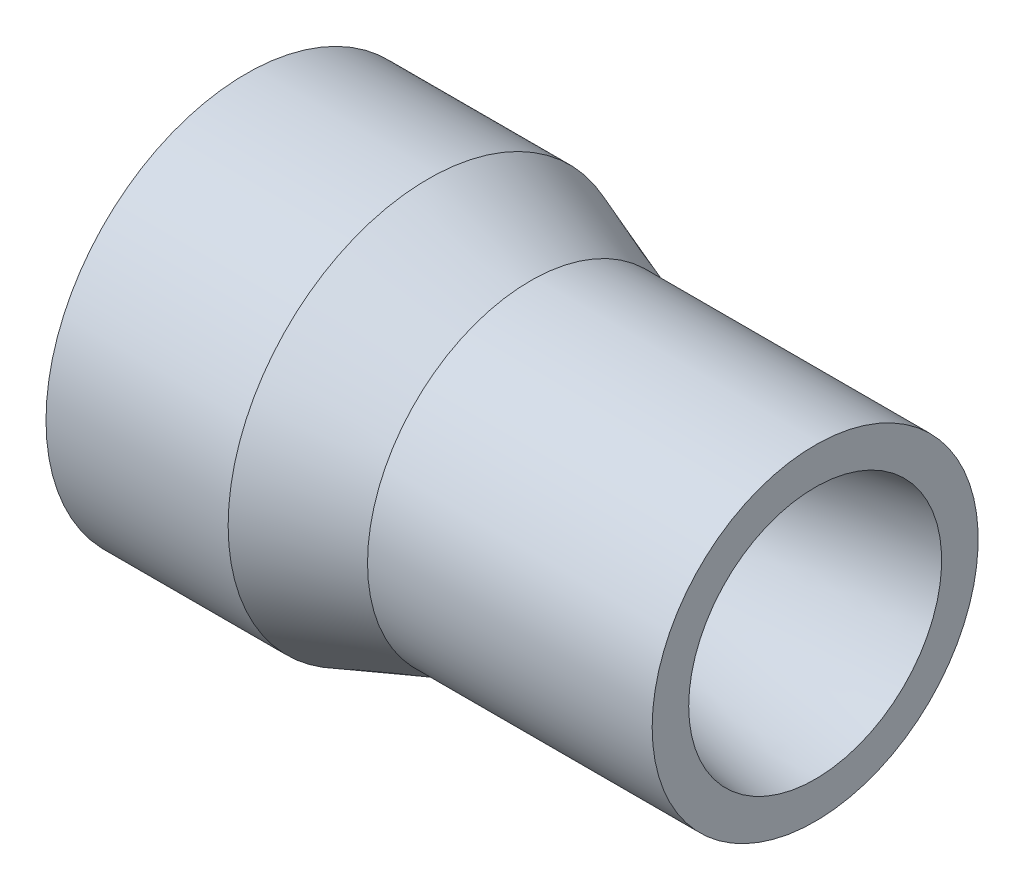
ISO-10303-21;
HEADER;
FILE_DESCRIPTION(('STEP AP214'),'2;1');
FILE_NAME('part.step','',(''),(''),'','','');
FILE_SCHEMA(('AUTOMOTIVE_DESIGN { 1 0 10303 214 1 1 1 1 }'));
ENDSEC;
DATA;
#1=APPLICATION_CONTEXT('core data for automotive mechanical design processes');
#2=APPLICATION_PROTOCOL_DEFINITION('international standard','automotive_design',2000,#1);
#3=PRODUCT_CONTEXT('',#1,'mechanical');
#4=PRODUCT('Part','Part','',(#3));
#5=PRODUCT_RELATED_PRODUCT_CATEGORY('part','',(#4));
#6=PRODUCT_DEFINITION_FORMATION('','',#4);
#7=PRODUCT_DEFINITION_CONTEXT('part definition',#1,'design');
#8=PRODUCT_DEFINITION('design','',#6,#7);
#9=PRODUCT_DEFINITION_SHAPE('','',#8);
#10=(LENGTH_UNIT() NAMED_UNIT(*) SI_UNIT(.MILLI.,.METRE.));
#11=(NAMED_UNIT(*) PLANE_ANGLE_UNIT() SI_UNIT($,.RADIAN.));
#12=(NAMED_UNIT(*) SI_UNIT($,.STERADIAN.) SOLID_ANGLE_UNIT());
#13=UNCERTAINTY_MEASURE_WITH_UNIT(LENGTH_MEASURE(1.E-05),#10,'distance_accuracy_value','');
#14=(GEOMETRIC_REPRESENTATION_CONTEXT(3) GLOBAL_UNCERTAINTY_ASSIGNED_CONTEXT((#13)) GLOBAL_UNIT_ASSIGNED_CONTEXT((#10,
#11,#12)) REPRESENTATION_CONTEXT('',''));
#15=CARTESIAN_POINT('',(0.,0.,0.));
#16=DIRECTION('',(0.,0.,1.));
#17=DIRECTION('',(1.,0.,0.));
#18=AXIS2_PLACEMENT_3D('',#15,#16,#17);
#19=CARTESIAN_POINT('',(-2.79521626221381,0.,0.));
#20=DIRECTION('',(-1.,0.,0.));
#21=DIRECTION('',(0.,0.,1.));
#22=AXIS2_PLACEMENT_3D('',#19,#20,#21);
#23=DEGENERATE_TOROIDAL_SURFACE('',#22,42.7018551138408,85.61,.F.);
#24=CARTESIAN_POINT('',(40.0097837377863,0.,0.));
#25=DIRECTION('',(-1.,0.,0.));
#26=DIRECTION('',(0.,0.,1.));
#27=AXIS2_PLACEMENT_3D('',#24,#25,#26);
#28=CIRCLE('',#27,31.4385797041449);
#29=CARTESIAN_POINT('',(40.0097837377863,0.,31.4385797041449));
#30=VERTEX_POINT('',#29);
#31=EDGE_CURVE('E86',#30,#30,#28,.T.);
#32=ORIENTED_EDGE('',*,*,#31,.F.);
#33=EDGE_LOOP('',(#32));
#34=FACE_BOUND('',#33,.T.);
#35=CARTESIAN_POINT('',(0.,0.,0.));
#36=DIRECTION('',(-1.,0.,0.));
#37=DIRECTION('',(0.,0.,1.));
#38=AXIS2_PLACEMENT_3D('',#35,#36,#37);
#39=CIRCLE('',#38,42.8625);
#40=CARTESIAN_POINT('',(0.,0.,42.8625));
#41=VERTEX_POINT('',#40);
#42=EDGE_CURVE('E10',#41,#41,#39,.T.);
#43=ORIENTED_EDGE('',*,*,#42,.T.);
#44=EDGE_LOOP('',(#43));
#45=FACE_BOUND('',#44,.T.);
#46=ADVANCED_FACE('F41',(#34,#45),#23,.T.);
#47=CARTESIAN_POINT('',(0.,42.8625,0.));
#48=DIRECTION('',(1.,0.,0.));
#49=DIRECTION('',(0.,0.,-1.));
#50=AXIS2_PLACEMENT_3D('',#47,#48,#49);
#51=PLANE('',#50);
#52=ORIENTED_EDGE('',*,*,#42,.F.);
#53=EDGE_LOOP('',(#52));
#54=FACE_BOUND('',#53,.T.);
#55=CARTESIAN_POINT('',(0.,0.,0.));
#56=DIRECTION('',(-1.,0.,0.));
#57=DIRECTION('',(0.,0.,1.));
#58=AXIS2_PLACEMENT_3D('',#55,#56,#57);
#59=CIRCLE('',#58,52.197);
#60=CARTESIAN_POINT('',(0.,0.,52.197));
#61=VERTEX_POINT('',#60);
#62=EDGE_CURVE('E48',#61,#61,#59,.T.);
#63=ORIENTED_EDGE('',*,*,#62,.T.);
#64=EDGE_LOOP('',(#63));
#65=FACE_BOUND('',#64,.T.);
#66=ADVANCED_FACE('F118',(#54,#65),#51,.F.);
#67=CARTESIAN_POINT('',(0.,0.,0.));
#68=DIRECTION('',(-1.,0.,0.));
#69=DIRECTION('',(0.,0.,1.));
#70=AXIS2_PLACEMENT_3D('',#67,#68,#69);
#71=CYLINDRICAL_SURFACE('',#70,52.197);
#72=ORIENTED_EDGE('',*,*,#62,.F.);
#73=EDGE_LOOP('',(#72));
#74=FACE_BOUND('',#73,.T.);
#75=CARTESIAN_POINT('',(47.4877114635485,0.,0.));
#76=DIRECTION('',(-1.,0.,0.));
#77=DIRECTION('',(0.,0.,1.));
#78=AXIS2_PLACEMENT_3D('',#75,#76,#77);
#79=CIRCLE('',#78,52.197);
#80=CARTESIAN_POINT('',(47.4877114635485,0.,52.197));
#81=VERTEX_POINT('',#80);
#82=EDGE_CURVE('E54',#81,#81,#79,.T.);
#83=ORIENTED_EDGE('',*,*,#82,.T.);
#84=EDGE_LOOP('',(#83));
#85=FACE_BOUND('',#84,.T.);
#86=ADVANCED_FACE('F115',(#74,#85),#71,.T.);
#87=CARTESIAN_POINT('',(74.13,0.,0.));
#88=DIRECTION('',(-1.,0.,0.));
#89=DIRECTION('',(0.,0.,1.));
#90=AXIS2_PLACEMENT_3D('',#87,#88,#89);
#91=CONICAL_SURFACE('',#90,42.5,0.349065850398866);
#92=ORIENTED_EDGE('',*,*,#82,.F.);
#93=EDGE_LOOP('',(#92));
#94=FACE_BOUND('',#93,.T.);
#95=CARTESIAN_POINT('',(74.13,0.,0.));
#96=DIRECTION('',(-1.,0.,0.));
#97=DIRECTION('',(0.,0.,1.));
#98=AXIS2_PLACEMENT_3D('',#95,#96,#97);
#99=CIRCLE('',#98,42.5);
#100=CARTESIAN_POINT('',(74.13,0.,42.5));
#101=VERTEX_POINT('',#100);
#102=EDGE_CURVE('E60',#101,#101,#99,.T.);
#103=ORIENTED_EDGE('',*,*,#102,.T.);
#104=EDGE_LOOP('',(#103));
#105=FACE_BOUND('',#104,.T.);
#106=ADVANCED_FACE('F111',(#94,#105),#91,.T.);
#107=CARTESIAN_POINT('',(0.,0.,0.));
#108=DIRECTION('',(-1.,0.,0.));
#109=DIRECTION('',(0.,0.,1.));
#110=AXIS2_PLACEMENT_3D('',#107,#108,#109);
#111=CYLINDRICAL_SURFACE('',#110,42.5);
#112=ORIENTED_EDGE('',*,*,#102,.F.);
#113=EDGE_LOOP('',(#112));
#114=FACE_BOUND('',#113,.T.);
#115=CARTESIAN_POINT('',(148.34,0.,0.));
#116=DIRECTION('',(-1.,0.,0.));
#117=DIRECTION('',(0.,0.,1.));
#118=AXIS2_PLACEMENT_3D('',#115,#116,#117);
#119=CIRCLE('',#118,42.5);
#120=CARTESIAN_POINT('',(148.34,0.,42.5));
#121=VERTEX_POINT('',#120);
#122=EDGE_CURVE('E66',#121,#121,#119,.T.);
#123=ORIENTED_EDGE('',*,*,#122,.T.);
#124=EDGE_LOOP('',(#123));
#125=FACE_BOUND('',#124,.T.);
#126=ADVANCED_FACE('F107',(#114,#125),#111,.T.);
#127=CARTESIAN_POINT('',(148.34,32.975,0.));
#128=DIRECTION('',(-1.,0.,0.));
#129=DIRECTION('',(0.,0.,1.));
#130=AXIS2_PLACEMENT_3D('',#127,#128,#129);
#131=PLANE('',#130);
#132=ORIENTED_EDGE('',*,*,#122,.F.);
#133=EDGE_LOOP('',(#132));
#134=FACE_BOUND('',#133,.T.);
#135=CARTESIAN_POINT('',(148.34,0.,0.));
#136=DIRECTION('',(-1.,0.,0.));
#137=DIRECTION('',(0.,0.,1.));
#138=AXIS2_PLACEMENT_3D('',#135,#136,#137);
#139=CIRCLE('',#138,32.975);
#140=CARTESIAN_POINT('',(148.34,0.,32.975));
#141=VERTEX_POINT('',#140);
#142=EDGE_CURVE('E70',#141,#141,#139,.T.);
#143=ORIENTED_EDGE('',*,*,#142,.T.);
#144=EDGE_LOOP('',(#143));
#145=FACE_BOUND('',#144,.T.);
#146=ADVANCED_FACE('F102',(#134,#145),#131,.F.);
#147=CARTESIAN_POINT('',(76.0448047049782,15.6078337942569,0.));
#148=CARTESIAN_POINT('',(97.2352372555907,22.9622506153776,0.));
#149=CARTESIAN_POINT('',(126.012294014913,29.8370455638665,0.));
#150=CARTESIAN_POINT('',(148.34,32.975,0.));
#151=B_SPLINE_CURVE_WITH_KNOTS('',3,(#147,#148,#149,#150),.UNSPECIFIED.,.F.,.F.,(4,4),(0.,1.),.UNSPECIFIED.);
#152=CARTESIAN_POINT('',(0.,0.,0.));
#153=DIRECTION('',(-1.,0.,0.));
#154=AXIS1_PLACEMENT('',#152,#153);
#155=SURFACE_OF_REVOLUTION('',#151,#154);
#156=ORIENTED_EDGE('',*,*,#142,.F.);
#157=EDGE_LOOP('',(#156));
#158=FACE_BOUND('',#157,.T.);
#159=CARTESIAN_POINT('',(76.0448047049782,0.,0.));
#160=DIRECTION('',(-1.,0.,0.));
#161=DIRECTION('',(0.,0.,1.));
#162=AXIS2_PLACEMENT_3D('',#159,#160,#161);
#163=CIRCLE('',#162,15.6078337942569);
#164=CARTESIAN_POINT('',(76.0448047049782,0.,15.6078337942569));
#165=VERTEX_POINT('',#164);
#166=EDGE_CURVE('E74',#165,#165,#163,.T.);
#167=ORIENTED_EDGE('',*,*,#166,.T.);
#168=EDGE_LOOP('',(#167));
#169=FACE_BOUND('',#168,.T.);
#170=ADVANCED_FACE('F97',(#158,#169),#155,.T.);
#171=CARTESIAN_POINT('',(74.13,0.,0.));
#172=DIRECTION('',(-1.,0.,0.));
#173=DIRECTION('',(0.,0.,1.));
#174=AXIS2_PLACEMENT_3D('',#171,#172,#173);
#175=TOROIDAL_SURFACE('',#174,21.125,5.84);
#176=ORIENTED_EDGE('',*,*,#166,.F.);
#177=EDGE_LOOP('',(#176));
#178=FACE_BOUND('',#177,.T.);
#179=CARTESIAN_POINT('',(74.13,0.,0.));
#180=DIRECTION('',(-1.,0.,0.));
#181=DIRECTION('',(0.,0.,1.));
#182=AXIS2_PLACEMENT_3D('',#179,#180,#181);
#183=CIRCLE('',#182,15.285);
#184=CARTESIAN_POINT('',(74.13,0.,15.285));
#185=VERTEX_POINT('',#184);
#186=EDGE_CURVE('E78',#185,#185,#183,.T.);
#187=ORIENTED_EDGE('',*,*,#186,.T.);
#188=EDGE_LOOP('',(#187));
#189=FACE_BOUND('',#188,.T.);
#190=ADVANCED_FACE('F101',(#178,#189),#175,.T.);
#191=CARTESIAN_POINT('',(74.13,0.,0.));
#192=DIRECTION('',(-1.,0.,0.));
#193=DIRECTION('',(0.,0.,1.));
#194=AXIS2_PLACEMENT_3D('',#191,#192,#193);
#195=TOROIDAL_SURFACE('',#194,38.205,22.92);
#196=ORIENTED_EDGE('',*,*,#186,.F.);
#197=EDGE_LOOP('',(#196));
#198=FACE_BOUND('',#197,.T.);
#199=CARTESIAN_POINT('',(62.67,0.,0.));
#200=DIRECTION('',(-1.,0.,0.));
#201=DIRECTION('',(0.,0.,1.));
#202=AXIS2_PLACEMENT_3D('',#199,#200,#201);
#203=CIRCLE('',#202,18.3556977452607);
#204=CARTESIAN_POINT('',(62.67,0.,18.3556977452607));
#205=VERTEX_POINT('',#204);
#206=EDGE_CURVE('E82',#205,#205,#203,.T.);
#207=ORIENTED_EDGE('',*,*,#206,.T.);
#208=EDGE_LOOP('',(#207));
#209=FACE_BOUND('',#208,.T.);
#210=ADVANCED_FACE('F132',(#198,#209),#195,.T.);
#211=CARTESIAN_POINT('',(40.0097837377863,0.,0.));
#212=DIRECTION('',(-1.,0.,0.));
#213=DIRECTION('',(0.,0.,1.));
#214=AXIS2_PLACEMENT_3D('',#211,#212,#213);
#215=CONICAL_SURFACE('',#214,31.4385797041449,0.523598775598301);
#216=ORIENTED_EDGE('',*,*,#206,.F.);
#217=EDGE_LOOP('',(#216));
#218=FACE_BOUND('',#217,.T.);
#219=ORIENTED_EDGE('',*,*,#31,.T.);
#220=EDGE_LOOP('',(#219));
#221=FACE_BOUND('',#220,.T.);
#222=ADVANCED_FACE('F130',(#218,#221),#215,.F.);
#223=CLOSED_SHELL('',(#46,#66,#86,#106,#126,#146,#170,#190,#210,#222));
#224=MANIFOLD_SOLID_BREP('B2',#223);
#225=ADVANCED_BREP_SHAPE_REPRESENTATION('',(#18,#224),#14);
#226=SHAPE_DEFINITION_REPRESENTATION(#9,#225);
ENDSEC;
END-ISO-10303-21;
